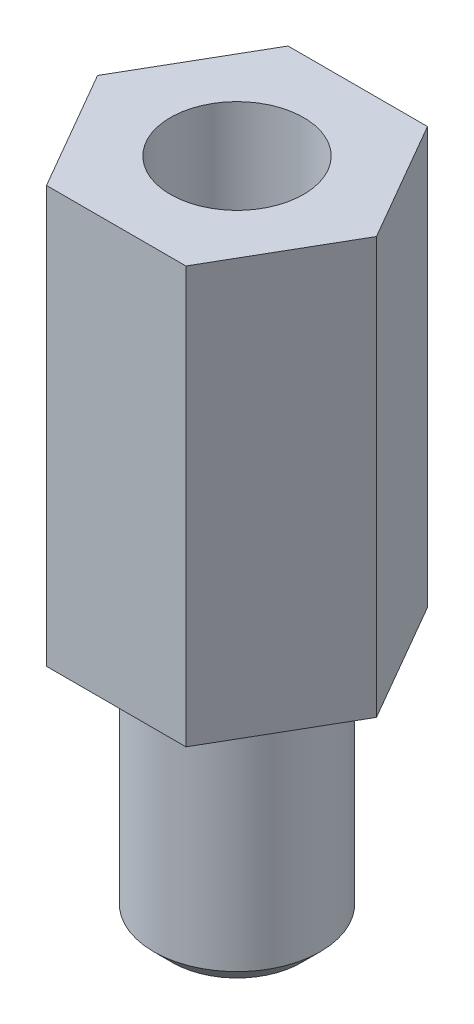
ISO-10303-21;
HEADER;
FILE_DESCRIPTION(('STEP AP214'),'2;1');
FILE_NAME('part.step','',(''),(''),'','','');
FILE_SCHEMA(('AUTOMOTIVE_DESIGN { 1 0 10303 214 1 1 1 1 }'));
ENDSEC;
DATA;
#1=APPLICATION_CONTEXT('core data for automotive mechanical design processes');
#2=APPLICATION_PROTOCOL_DEFINITION('international standard','automotive_design',2000,#1);
#3=PRODUCT_CONTEXT('',#1,'mechanical');
#4=PRODUCT('Part','Part','',(#3));
#5=PRODUCT_RELATED_PRODUCT_CATEGORY('part','',(#4));
#6=PRODUCT_DEFINITION_FORMATION('','',#4);
#7=PRODUCT_DEFINITION_CONTEXT('part definition',#1,'design');
#8=PRODUCT_DEFINITION('design','',#6,#7);
#9=PRODUCT_DEFINITION_SHAPE('','',#8);
#10=(LENGTH_UNIT() NAMED_UNIT(*) SI_UNIT(.MILLI.,.METRE.));
#11=(NAMED_UNIT(*) PLANE_ANGLE_UNIT() SI_UNIT($,.RADIAN.));
#12=(NAMED_UNIT(*) SI_UNIT($,.STERADIAN.) SOLID_ANGLE_UNIT());
#13=UNCERTAINTY_MEASURE_WITH_UNIT(LENGTH_MEASURE(1.E-05),#10,'distance_accuracy_value','');
#14=(GEOMETRIC_REPRESENTATION_CONTEXT(3) GLOBAL_UNCERTAINTY_ASSIGNED_CONTEXT((#13)) GLOBAL_UNIT_ASSIGNED_CONTEXT((#10,
#11,#12)) REPRESENTATION_CONTEXT('',''));
#15=CARTESIAN_POINT('',(0.,0.,0.));
#16=DIRECTION('',(0.,0.,1.));
#17=DIRECTION('',(1.,0.,0.));
#18=AXIS2_PLACEMENT_3D('',#15,#16,#17);
#19=CARTESIAN_POINT('',(0.,5.,1.45));
#20=DIRECTION('',(0.,0.,-1.));
#21=DIRECTION('',(-1.,0.,0.));
#22=AXIS2_PLACEMENT_3D('',#19,#20,#21);
#23=PLANE('',#22);
#24=DIRECTION('',(1.,0.,0.));
#25=VECTOR('',#24,1.);
#26=CARTESIAN_POINT('',(0.,0.,1.45));
#27=LINE('',#26,#25);
#28=CARTESIAN_POINT('',(-0.837157890324945,0.,1.45000000000001));
#29=VERTEX_POINT('',#28);
#30=CARTESIAN_POINT('',(0.837157890324975,0.,1.44999999999999));
#31=VERTEX_POINT('',#30);
#32=EDGE_CURVE('E131',#29,#31,#27,.T.);
#33=ORIENTED_EDGE('',*,*,#32,.T.);
#34=DIRECTION('',(0.,-1.,0.));
#35=VECTOR('',#34,1.);
#36=CARTESIAN_POINT('',(0.837157890324975,5.,1.44999999999999));
#37=LINE('',#36,#35);
#38=CARTESIAN_POINT('',(0.837157890324975,5.,1.44999999999999));
#39=VERTEX_POINT('',#38);
#40=EDGE_CURVE('E11',#39,#31,#37,.T.);
#41=ORIENTED_EDGE('',*,*,#40,.F.);
#42=DIRECTION('',(1.,0.,0.));
#43=VECTOR('',#42,1.);
#44=CARTESIAN_POINT('',(0.,5.,1.45));
#45=LINE('',#44,#43);
#46=CARTESIAN_POINT('',(-0.837157890324945,5.,1.45000000000001));
#47=VERTEX_POINT('',#46);
#48=EDGE_CURVE('E142',#47,#39,#45,.T.);
#49=ORIENTED_EDGE('',*,*,#48,.F.);
#50=DIRECTION('',(0.,-1.,0.));
#51=VECTOR('',#50,1.);
#52=CARTESIAN_POINT('',(-0.837157890324945,5.,1.45000000000001));
#53=LINE('',#52,#51);
#54=EDGE_CURVE('E127',#47,#29,#53,.T.);
#55=ORIENTED_EDGE('',*,*,#54,.T.);
#56=EDGE_LOOP('',(#33,#41,#49,#55));
#57=FACE_BOUND('',#56,.T.);
#58=ADVANCED_FACE('F45',(#57),#23,.F.);
#59=CARTESIAN_POINT('',(1.25573683548745,5.,0.724999999999996));
#60=DIRECTION('',(-0.866025403784442,0.,-0.499999999999995));
#61=DIRECTION('',(-0.499999999999995,0.,0.866025403784442));
#62=AXIS2_PLACEMENT_3D('',#59,#60,#61);
#63=PLANE('',#62);
#64=DIRECTION('',(0.499999999999995,0.,-0.866025403784442));
#65=VECTOR('',#64,1.);
#66=CARTESIAN_POINT('',(1.25573683548745,0.,0.724999999999996));
#67=LINE('',#66,#65);
#68=CARTESIAN_POINT('',(1.67431578064992,0.,0.));
#69=VERTEX_POINT('',#68);
#70=EDGE_CURVE('E134',#31,#69,#67,.T.);
#71=ORIENTED_EDGE('',*,*,#70,.T.);
#72=DIRECTION('',(0.,-1.,0.));
#73=VECTOR('',#72,1.);
#74=CARTESIAN_POINT('',(1.67431578064992,5.,0.));
#75=LINE('',#74,#73);
#76=CARTESIAN_POINT('',(1.67431578064992,5.,0.));
#77=VERTEX_POINT('',#76);
#78=EDGE_CURVE('E53',#77,#69,#75,.T.);
#79=ORIENTED_EDGE('',*,*,#78,.F.);
#80=DIRECTION('',(0.499999999999995,0.,-0.866025403784442));
#81=VECTOR('',#80,1.);
#82=CARTESIAN_POINT('',(1.25573683548745,5.,0.724999999999996));
#83=LINE('',#82,#81);
#84=EDGE_CURVE('E99',#39,#77,#83,.T.);
#85=ORIENTED_EDGE('',*,*,#84,.F.);
#86=ORIENTED_EDGE('',*,*,#40,.T.);
#87=EDGE_LOOP('',(#71,#79,#85,#86));
#88=FACE_BOUND('',#87,.T.);
#89=ADVANCED_FACE('F168',(#88),#63,.F.);
#90=CARTESIAN_POINT('',(1.25573683548744,5.,-0.725000000000001));
#91=DIRECTION('',(-0.866025403784438,0.,0.500000000000001));
#92=DIRECTION('',(0.500000000000001,0.,0.866025403784438));
#93=AXIS2_PLACEMENT_3D('',#90,#91,#92);
#94=PLANE('',#93);
#95=DIRECTION('',(-0.500000000000001,0.,-0.866025403784438));
#96=VECTOR('',#95,1.);
#97=CARTESIAN_POINT('',(1.25573683548744,0.,-0.725000000000001));
#98=LINE('',#97,#96);
#99=CARTESIAN_POINT('',(0.837157890324954,0.,-1.45));
#100=VERTEX_POINT('',#99);
#101=EDGE_CURVE('E137',#69,#100,#98,.T.);
#102=ORIENTED_EDGE('',*,*,#101,.T.);
#103=DIRECTION('',(0.,-1.,0.));
#104=VECTOR('',#103,1.);
#105=CARTESIAN_POINT('',(0.837157890324954,5.,-1.45));
#106=LINE('',#105,#104);
#107=CARTESIAN_POINT('',(0.837157890324954,5.,-1.45));
#108=VERTEX_POINT('',#107);
#109=EDGE_CURVE('E122',#108,#100,#106,.T.);
#110=ORIENTED_EDGE('',*,*,#109,.F.);
#111=DIRECTION('',(-0.500000000000001,0.,-0.866025403784438));
#112=VECTOR('',#111,1.);
#113=CARTESIAN_POINT('',(1.25573683548744,5.,-0.725000000000001));
#114=LINE('',#113,#112);
#115=EDGE_CURVE('E113',#77,#108,#114,.T.);
#116=ORIENTED_EDGE('',*,*,#115,.F.);
#117=ORIENTED_EDGE('',*,*,#78,.T.);
#118=EDGE_LOOP('',(#102,#110,#116,#117));
#119=FACE_BOUND('',#118,.T.);
#120=ADVANCED_FACE('F148',(#119),#94,.F.);
#121=CARTESIAN_POINT('',(0.,5.,-1.45));
#122=DIRECTION('',(0.,0.,1.));
#123=DIRECTION('',(1.,0.,0.));
#124=AXIS2_PLACEMENT_3D('',#121,#122,#123);
#125=PLANE('',#124);
#126=DIRECTION('',(-1.,0.,0.));
#127=VECTOR('',#126,1.);
#128=CARTESIAN_POINT('',(0.,0.,-1.45));
#129=LINE('',#128,#127);
#130=CARTESIAN_POINT('',(-0.837157890324965,0.,-1.45));
#131=VERTEX_POINT('',#130);
#132=EDGE_CURVE('E121',#100,#131,#129,.T.);
#133=ORIENTED_EDGE('',*,*,#132,.T.);
#134=DIRECTION('',(0.,-1.,0.));
#135=VECTOR('',#134,1.);
#136=CARTESIAN_POINT('',(-0.837157890324965,5.,-1.45));
#137=LINE('',#136,#135);
#138=CARTESIAN_POINT('',(-0.837157890324965,5.,-1.45));
#139=VERTEX_POINT('',#138);
#140=EDGE_CURVE('E118',#139,#131,#137,.T.);
#141=ORIENTED_EDGE('',*,*,#140,.F.);
#142=DIRECTION('',(-1.,0.,0.));
#143=VECTOR('',#142,1.);
#144=CARTESIAN_POINT('',(0.,5.,-1.45));
#145=LINE('',#144,#143);
#146=EDGE_CURVE('E107',#108,#139,#145,.T.);
#147=ORIENTED_EDGE('',*,*,#146,.F.);
#148=ORIENTED_EDGE('',*,*,#109,.T.);
#149=EDGE_LOOP('',(#133,#141,#147,#148));
#150=FACE_BOUND('',#149,.T.);
#151=ADVANCED_FACE('F119',(#150),#125,.F.);
#152=CARTESIAN_POINT('',(-1.25573683548744,5.,-0.724999999999993));
#153=DIRECTION('',(0.866025403784442,0.,0.499999999999995));
#154=DIRECTION('',(0.499999999999995,0.,-0.866025403784442));
#155=AXIS2_PLACEMENT_3D('',#152,#153,#154);
#156=PLANE('',#155);
#157=DIRECTION('',(-0.499999999999995,0.,0.866025403784442));
#158=VECTOR('',#157,1.);
#159=CARTESIAN_POINT('',(-1.25573683548744,0.,-0.724999999999993));
#160=LINE('',#159,#158);
#161=CARTESIAN_POINT('',(-1.67431578064992,0.,0.));
#162=VERTEX_POINT('',#161);
#163=EDGE_CURVE('E85',#131,#162,#160,.T.);
#164=ORIENTED_EDGE('',*,*,#163,.T.);
#165=DIRECTION('',(0.,-1.,0.));
#166=VECTOR('',#165,1.);
#167=CARTESIAN_POINT('',(-1.67431578064992,5.,0.));
#168=LINE('',#167,#166);
#169=CARTESIAN_POINT('',(-1.67431578064992,5.,0.));
#170=VERTEX_POINT('',#169);
#171=EDGE_CURVE('E123',#170,#162,#168,.T.);
#172=ORIENTED_EDGE('',*,*,#171,.F.);
#173=DIRECTION('',(-0.499999999999995,0.,0.866025403784442));
#174=VECTOR('',#173,1.);
#175=CARTESIAN_POINT('',(-1.25573683548744,5.,-0.724999999999993));
#176=LINE('',#175,#174);
#177=EDGE_CURVE('E111',#139,#170,#176,.T.);
#178=ORIENTED_EDGE('',*,*,#177,.F.);
#179=ORIENTED_EDGE('',*,*,#140,.T.);
#180=EDGE_LOOP('',(#164,#172,#178,#179));
#181=FACE_BOUND('',#180,.T.);
#182=ADVANCED_FACE('F125',(#181),#156,.F.);
#183=CARTESIAN_POINT('',(-1.25573683548743,5.,0.72500000000001));
#184=DIRECTION('',(0.866025403784434,0.,-0.500000000000007));
#185=DIRECTION('',(-0.500000000000007,0.,-0.866025403784435));
#186=AXIS2_PLACEMENT_3D('',#183,#184,#185);
#187=PLANE('',#186);
#188=DIRECTION('',(0.500000000000007,0.,0.866025403784435));
#189=VECTOR('',#188,1.);
#190=CARTESIAN_POINT('',(-1.25573683548743,0.,0.72500000000001));
#191=LINE('',#190,#189);
#192=EDGE_CURVE('E91',#162,#29,#191,.T.);
#193=ORIENTED_EDGE('',*,*,#192,.T.);
#194=ORIENTED_EDGE('',*,*,#54,.F.);
#195=DIRECTION('',(0.500000000000007,0.,0.866025403784435));
#196=VECTOR('',#195,1.);
#197=CARTESIAN_POINT('',(-1.25573683548743,5.,0.72500000000001));
#198=LINE('',#197,#196);
#199=EDGE_CURVE('E61',#170,#47,#198,.T.);
#200=ORIENTED_EDGE('',*,*,#199,.F.);
#201=ORIENTED_EDGE('',*,*,#171,.T.);
#202=EDGE_LOOP('',(#193,#194,#200,#201));
#203=FACE_BOUND('',#202,.T.);
#204=ADVANCED_FACE('F155',(#203),#187,.F.);
#205=CARTESIAN_POINT('',(0.,5.,0.));
#206=DIRECTION('',(0.,1.,0.));
#207=DIRECTION('',(0.,0.,1.));
#208=AXIS2_PLACEMENT_3D('',#205,#206,#207);
#209=PLANE('',#208);
#210=CARTESIAN_POINT('',(0.,5.,0.));
#211=DIRECTION('',(0.,1.,0.));
#212=DIRECTION('',(0.,0.,1.));
#213=AXIS2_PLACEMENT_3D('',#210,#211,#212);
#214=CIRCLE('',#213,0.8);
#215=CARTESIAN_POINT('',(0.,5.,0.8));
#216=VERTEX_POINT('',#215);
#217=EDGE_CURVE('E282',#216,#216,#214,.T.);
#218=ORIENTED_EDGE('',*,*,#217,.F.);
#219=EDGE_LOOP('',(#218));
#220=FACE_BOUND('',#219,.T.);
#221=ORIENTED_EDGE('',*,*,#48,.T.);
#222=ORIENTED_EDGE('',*,*,#84,.T.);
#223=ORIENTED_EDGE('',*,*,#115,.T.);
#224=ORIENTED_EDGE('',*,*,#146,.T.);
#225=ORIENTED_EDGE('',*,*,#177,.T.);
#226=ORIENTED_EDGE('',*,*,#199,.T.);
#227=EDGE_LOOP('',(#221,#222,#223,#224,#225,#226));
#228=FACE_BOUND('',#227,.T.);
#229=ADVANCED_FACE('F109',(#220,#228),#209,.T.);
#230=CARTESIAN_POINT('',(0.,0.,0.));
#231=DIRECTION('',(0.,1.,0.));
#232=DIRECTION('',(0.,0.,1.));
#233=AXIS2_PLACEMENT_3D('',#230,#231,#232);
#234=PLANE('',#233);
#235=CARTESIAN_POINT('',(0.,0.,0.));
#236=DIRECTION('',(0.,1.,0.));
#237=DIRECTION('',(0.,0.,1.));
#238=AXIS2_PLACEMENT_3D('',#235,#236,#237);
#239=CIRCLE('',#238,1.);
#240=CARTESIAN_POINT('',(0.,0.,1.));
#241=VERTEX_POINT('',#240);
#242=EDGE_CURVE('E284',#241,#241,#239,.T.);
#243=ORIENTED_EDGE('',*,*,#242,.T.);
#244=EDGE_LOOP('',(#243));
#245=FACE_BOUND('',#244,.T.);
#246=ORIENTED_EDGE('',*,*,#32,.F.);
#247=ORIENTED_EDGE('',*,*,#192,.F.);
#248=ORIENTED_EDGE('',*,*,#163,.F.);
#249=ORIENTED_EDGE('',*,*,#132,.F.);
#250=ORIENTED_EDGE('',*,*,#101,.F.);
#251=ORIENTED_EDGE('',*,*,#70,.F.);
#252=EDGE_LOOP('',(#246,#247,#248,#249,#250,#251));
#253=FACE_BOUND('',#252,.T.);
#254=ADVANCED_FACE('F151',(#245,#253),#234,.F.);
#255=CARTESIAN_POINT('',(0.774,-3.,0.));
#256=DIRECTION('',(0.,-1.,0.));
#257=DIRECTION('',(0.,0.,-1.));
#258=AXIS2_PLACEMENT_3D('',#255,#256,#257);
#259=PLANE('',#258);
#260=CARTESIAN_POINT('',(0.,-3.,0.));
#261=DIRECTION('',(0.,1.,0.));
#262=DIRECTION('',(0.,0.,1.));
#263=AXIS2_PLACEMENT_3D('',#260,#261,#262);
#264=CIRCLE('',#263,0.774);
#265=CARTESIAN_POINT('',(0.,-3.,0.774));
#266=VERTEX_POINT('',#265);
#267=EDGE_CURVE('E135',#266,#266,#264,.T.);
#268=ORIENTED_EDGE('',*,*,#267,.F.);
#269=EDGE_LOOP('',(#268));
#270=FACE_BOUND('',#269,.T.);
#271=ADVANCED_FACE('F210',(#270),#259,.T.);
#272=CARTESIAN_POINT('',(0.,-2.774,0.));
#273=DIRECTION('',(0.,1.,0.));
#274=DIRECTION('',(0.,0.,1.));
#275=AXIS2_PLACEMENT_3D('',#272,#273,#274);
#276=CONICAL_SURFACE('',#275,1.,0.785398163397449);
#277=ORIENTED_EDGE('',*,*,#267,.T.);
#278=EDGE_LOOP('',(#277));
#279=FACE_BOUND('',#278,.T.);
#280=CARTESIAN_POINT('',(0.,-2.774,0.));
#281=DIRECTION('',(0.,1.,0.));
#282=DIRECTION('',(0.,0.,1.));
#283=AXIS2_PLACEMENT_3D('',#280,#281,#282);
#284=CIRCLE('',#283,1.);
#285=CARTESIAN_POINT('',(0.,-2.774,1.));
#286=VERTEX_POINT('',#285);
#287=EDGE_CURVE('E289',#286,#286,#284,.T.);
#288=ORIENTED_EDGE('',*,*,#287,.F.);
#289=EDGE_LOOP('',(#288));
#290=FACE_BOUND('',#289,.T.);
#291=ADVANCED_FACE('F220',(#279,#290),#276,.T.);
#292=CARTESIAN_POINT('',(0.,0.,0.));
#293=DIRECTION('',(0.,1.,0.));
#294=DIRECTION('',(0.,0.,1.));
#295=AXIS2_PLACEMENT_3D('',#292,#293,#294);
#296=CYLINDRICAL_SURFACE('',#295,1.);
#297=ORIENTED_EDGE('',*,*,#287,.T.);
#298=EDGE_LOOP('',(#297));
#299=FACE_BOUND('',#298,.T.);
#300=ORIENTED_EDGE('',*,*,#242,.F.);
#301=EDGE_LOOP('',(#300));
#302=FACE_BOUND('',#301,.T.);
#303=ADVANCED_FACE('F231',(#299,#302),#296,.T.);
#304=CARTESIAN_POINT('',(0.,2.,0.));
#305=DIRECTION('',(0.,1.,0.));
#306=DIRECTION('',(0.,0.,1.));
#307=AXIS2_PLACEMENT_3D('',#304,#305,#306);
#308=CONICAL_SURFACE('',#307,0.799999999999999,1.02974425867665);
#309=CARTESIAN_POINT('',(0.,1.51931150477795,0.));
#310=VERTEX_POINT('',#309);
#311=VERTEX_LOOP('',#310);
#312=FACE_BOUND('',#311,.T.);
#313=CARTESIAN_POINT('',(0.,2.,0.));
#314=DIRECTION('',(0.,1.,0.));
#315=DIRECTION('',(0.,0.,1.));
#316=AXIS2_PLACEMENT_3D('',#313,#314,#315);
#317=CIRCLE('',#316,0.799999999999999);
#318=CARTESIAN_POINT('',(0.,2.,0.799999999999999));
#319=VERTEX_POINT('',#318);
#320=EDGE_CURVE('E279',#319,#319,#317,.T.);
#321=ORIENTED_EDGE('',*,*,#320,.T.);
#322=EDGE_LOOP('',(#321));
#323=FACE_BOUND('',#322,.T.);
#324=ADVANCED_FACE('F241',(#312,#323),#308,.F.);
#325=CARTESIAN_POINT('',(0.,5.,0.));
#326=DIRECTION('',(0.,1.,0.));
#327=DIRECTION('',(0.,0.,1.));
#328=AXIS2_PLACEMENT_3D('',#325,#326,#327);
#329=CYLINDRICAL_SURFACE('',#328,0.799999999999999);
#330=ORIENTED_EDGE('',*,*,#320,.F.);
#331=EDGE_LOOP('',(#330));
#332=FACE_BOUND('',#331,.T.);
#333=ORIENTED_EDGE('',*,*,#217,.T.);
#334=EDGE_LOOP('',(#333));
#335=FACE_BOUND('',#334,.T.);
#336=ADVANCED_FACE('F251',(#332,#335),#329,.F.);
#337=CLOSED_SHELL('',(#58,#89,#120,#151,#182,#204,#229,#254,#271,#291,#303,#324,#336));
#338=MANIFOLD_SOLID_BREP('B2',#337);
#339=ADVANCED_BREP_SHAPE_REPRESENTATION('',(#18,#338),#14);
#340=SHAPE_DEFINITION_REPRESENTATION(#9,#339);
ENDSEC;
END-ISO-10303-21;
